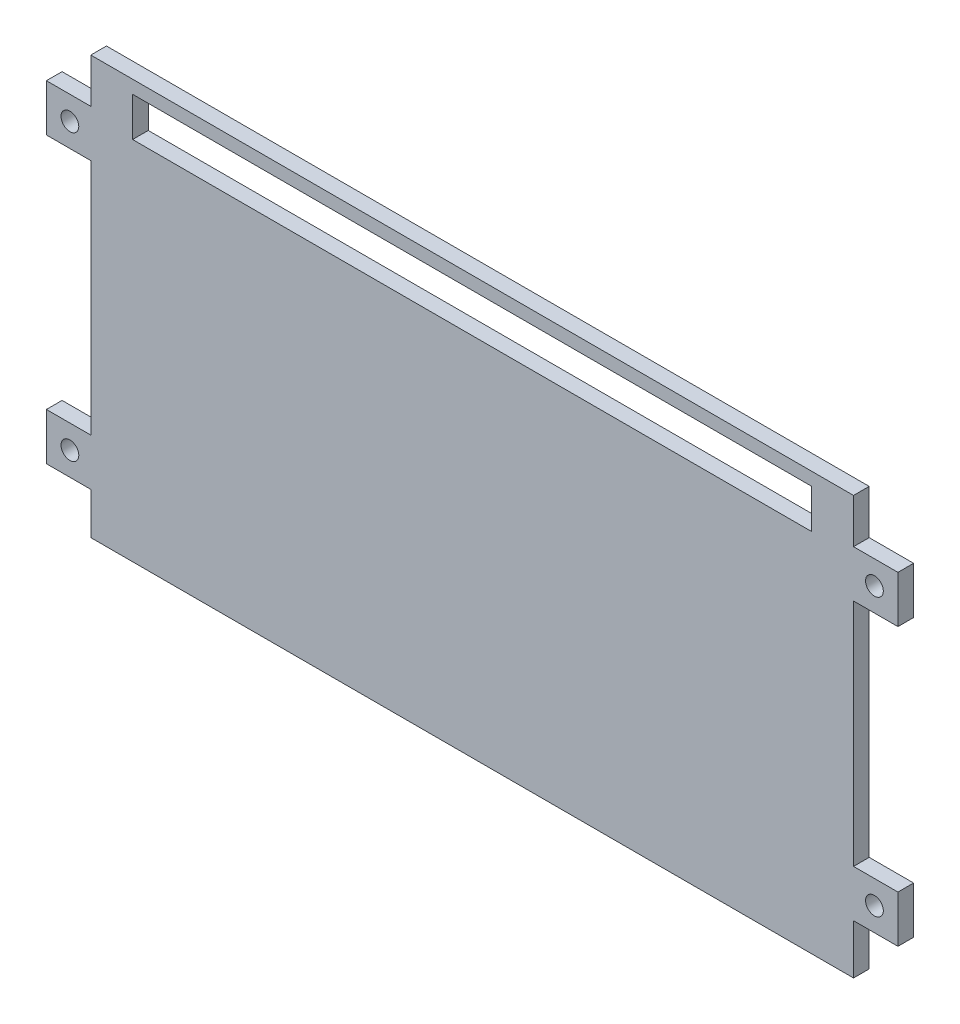
ISO-10303-21;
HEADER;
FILE_DESCRIPTION(('STEP AP214'),'2;1');
FILE_NAME('part.step','',(''),(''),'','','');
FILE_SCHEMA(('AUTOMOTIVE_DESIGN { 1 0 10303 214 1 1 1 1 }'));
ENDSEC;
DATA;
#1=APPLICATION_CONTEXT('core data for automotive mechanical design processes');
#2=APPLICATION_PROTOCOL_DEFINITION('international standard','automotive_design',2000,#1);
#3=PRODUCT_CONTEXT('',#1,'mechanical');
#4=PRODUCT('Part','Part','',(#3));
#5=PRODUCT_RELATED_PRODUCT_CATEGORY('part','',(#4));
#6=PRODUCT_DEFINITION_FORMATION('','',#4);
#7=PRODUCT_DEFINITION_CONTEXT('part definition',#1,'design');
#8=PRODUCT_DEFINITION('design','',#6,#7);
#9=PRODUCT_DEFINITION_SHAPE('','',#8);
#10=(LENGTH_UNIT() NAMED_UNIT(*) SI_UNIT(.MILLI.,.METRE.));
#11=(NAMED_UNIT(*) PLANE_ANGLE_UNIT() SI_UNIT($,.RADIAN.));
#12=(NAMED_UNIT(*) SI_UNIT($,.STERADIAN.) SOLID_ANGLE_UNIT());
#13=UNCERTAINTY_MEASURE_WITH_UNIT(LENGTH_MEASURE(1.E-05),#10,'distance_accuracy_value','');
#14=(GEOMETRIC_REPRESENTATION_CONTEXT(3) GLOBAL_UNCERTAINTY_ASSIGNED_CONTEXT((#13)) GLOBAL_UNIT_ASSIGNED_CONTEXT((#10,
#11,#12)) REPRESENTATION_CONTEXT('',''));
#15=CARTESIAN_POINT('',(0.,0.,0.));
#16=DIRECTION('',(0.,0.,1.));
#17=DIRECTION('',(1.,0.,0.));
#18=AXIS2_PLACEMENT_3D('',#15,#16,#17);
#19=CARTESIAN_POINT('',(112.,-117.,217.3));
#20=DIRECTION('',(0.,0.,1.));
#21=DIRECTION('',(1.,0.,0.));
#22=AXIS2_PLACEMENT_3D('',#19,#20,#21);
#23=CYLINDRICAL_SURFACE('',#22,1.7);
#24=DIRECTION('',(0.,0.,1.));
#25=VECTOR('',#24,1.);
#26=CARTESIAN_POINT('',(113.7,-117.,217.3));
#27=LINE('',#26,#25);
#28=CARTESIAN_POINT('',(113.7,-117.,217.5));
#29=VERTEX_POINT('',#28);
#30=CARTESIAN_POINT('',(113.7,-117.,220.5));
#31=VERTEX_POINT('',#30);
#32=EDGE_CURVE('E10',#29,#31,#27,.T.);
#33=ORIENTED_EDGE('',*,*,#32,.F.);
#34=CARTESIAN_POINT('',(112.,-117.,217.5));
#35=DIRECTION('',(0.,0.,1.));
#36=DIRECTION('',(1.,0.,0.));
#37=AXIS2_PLACEMENT_3D('',#34,#35,#36);
#38=CIRCLE('',#37,1.7);
#39=EDGE_CURVE('E312',#29,#29,#38,.T.);
#40=ORIENTED_EDGE('',*,*,#39,.F.);
#41=ORIENTED_EDGE('',*,*,#32,.T.);
#42=CARTESIAN_POINT('',(112.,-117.,220.5));
#43=DIRECTION('',(0.,0.,1.));
#44=DIRECTION('',(1.,0.,0.));
#45=AXIS2_PLACEMENT_3D('',#42,#43,#44);
#46=CIRCLE('',#45,1.7);
#47=EDGE_CURVE('E445',#31,#31,#46,.T.);
#48=ORIENTED_EDGE('',*,*,#47,.T.);
#49=EDGE_LOOP('',(#33,#40,#41,#48));
#50=FACE_BOUND('',#49,.T.);
#51=ADVANCED_FACE('F15',(#50),#23,.F.);
#52=CARTESIAN_POINT('',(-30.,-106.5,217.4));
#53=DIRECTION('',(0.,1.,0.));
#54=DIRECTION('',(1.,0.,0.));
#55=AXIS2_PLACEMENT_3D('',#52,#53,#54);
#56=PLANE('',#55);
#57=DIRECTION('',(-1.,0.,0.));
#58=VECTOR('',#57,1.);
#59=CARTESIAN_POINT('',(-34.,-106.5,220.5));
#60=LINE('',#59,#58);
#61=CARTESIAN_POINT('',(100.,-106.5,220.5));
#62=VERTEX_POINT('',#61);
#63=CARTESIAN_POINT('',(-30.,-106.5,220.5));
#64=VERTEX_POINT('',#63);
#65=EDGE_CURVE('E277',#62,#64,#60,.T.);
#66=ORIENTED_EDGE('',*,*,#65,.T.);
#67=DIRECTION('',(0.,0.,1.));
#68=VECTOR('',#67,1.);
#69=CARTESIAN_POINT('',(-30.,-106.5,217.4));
#70=LINE('',#69,#68);
#71=CARTESIAN_POINT('',(-30.,-106.5,217.5));
#72=VERTEX_POINT('',#71);
#73=EDGE_CURVE('E26',#72,#64,#70,.T.);
#74=ORIENTED_EDGE('',*,*,#73,.F.);
#75=DIRECTION('',(-1.,0.,0.));
#76=VECTOR('',#75,1.);
#77=CARTESIAN_POINT('',(-34.,-106.5,217.5));
#78=LINE('',#77,#76);
#79=CARTESIAN_POINT('',(100.,-106.5,217.5));
#80=VERTEX_POINT('',#79);
#81=EDGE_CURVE('E382',#80,#72,#78,.T.);
#82=ORIENTED_EDGE('',*,*,#81,.F.);
#83=DIRECTION('',(0.,0.,1.));
#84=VECTOR('',#83,1.);
#85=CARTESIAN_POINT('',(100.,-106.5,217.4));
#86=LINE('',#85,#84);
#87=EDGE_CURVE('E308',#80,#62,#86,.T.);
#88=ORIENTED_EDGE('',*,*,#87,.T.);
#89=EDGE_LOOP('',(#66,#74,#82,#88));
#90=FACE_BOUND('',#89,.T.);
#91=ADVANCED_FACE('F612',(#90),#56,.F.);
#92=CARTESIAN_POINT('',(-30.,-114.,217.4));
#93=DIRECTION('',(1.,0.,0.));
#94=DIRECTION('',(0.,1.,0.));
#95=AXIS2_PLACEMENT_3D('',#92,#93,#94);
#96=PLANE('',#95);
#97=DIRECTION('',(0.,0.,1.));
#98=VECTOR('',#97,1.);
#99=CARTESIAN_POINT('',(-30.,-114.,217.4));
#100=LINE('',#99,#98);
#101=CARTESIAN_POINT('',(-30.,-114.,217.5));
#102=VERTEX_POINT('',#101);
#103=CARTESIAN_POINT('',(-30.,-114.,220.5));
#104=VERTEX_POINT('',#103);
#105=EDGE_CURVE('E311',#102,#104,#100,.T.);
#106=ORIENTED_EDGE('',*,*,#105,.F.);
#107=DIRECTION('',(0.,1.,0.));
#108=VECTOR('',#107,1.);
#109=CARTESIAN_POINT('',(-30.,-149.,217.5));
#110=LINE('',#109,#108);
#111=EDGE_CURVE('E329',#102,#72,#110,.T.);
#112=ORIENTED_EDGE('',*,*,#111,.T.);
#113=ORIENTED_EDGE('',*,*,#73,.T.);
#114=DIRECTION('',(0.,1.,0.));
#115=VECTOR('',#114,1.);
#116=CARTESIAN_POINT('',(-30.,-149.,220.5));
#117=LINE('',#116,#115);
#118=EDGE_CURVE('E282',#104,#64,#117,.T.);
#119=ORIENTED_EDGE('',*,*,#118,.F.);
#120=EDGE_LOOP('',(#106,#112,#113,#119));
#121=FACE_BOUND('',#120,.T.);
#122=ADVANCED_FACE('F17',(#121),#96,.T.);
#123=CARTESIAN_POINT('',(100.,-114.,217.4));
#124=DIRECTION('',(1.,0.,0.));
#125=DIRECTION('',(0.,1.,0.));
#126=AXIS2_PLACEMENT_3D('',#123,#124,#125);
#127=PLANE('',#126);
#128=DIRECTION('',(0.,1.,0.));
#129=VECTOR('',#128,1.);
#130=CARTESIAN_POINT('',(100.,-149.,220.5));
#131=LINE('',#130,#129);
#132=CARTESIAN_POINT('',(100.,-114.,220.5));
#133=VERTEX_POINT('',#132);
#134=EDGE_CURVE('E281',#133,#62,#131,.T.);
#135=ORIENTED_EDGE('',*,*,#134,.T.);
#136=ORIENTED_EDGE('',*,*,#87,.F.);
#137=DIRECTION('',(0.,1.,0.));
#138=VECTOR('',#137,1.);
#139=CARTESIAN_POINT('',(100.,-149.,217.5));
#140=LINE('',#139,#138);
#141=CARTESIAN_POINT('',(100.,-114.,217.5));
#142=VERTEX_POINT('',#141);
#143=EDGE_CURVE('E378',#142,#80,#140,.T.);
#144=ORIENTED_EDGE('',*,*,#143,.F.);
#145=DIRECTION('',(0.,0.,1.));
#146=VECTOR('',#145,1.);
#147=CARTESIAN_POINT('',(100.,-114.,217.4));
#148=LINE('',#147,#146);
#149=EDGE_CURVE('E350',#142,#133,#148,.T.);
#150=ORIENTED_EDGE('',*,*,#149,.T.);
#151=EDGE_LOOP('',(#135,#136,#144,#150));
#152=FACE_BOUND('',#151,.T.);
#153=ADVANCED_FACE('F627',(#152),#127,.F.);
#154=CARTESIAN_POINT('',(-30.,-114.,217.4));
#155=DIRECTION('',(0.,1.,0.));
#156=DIRECTION('',(1.,0.,0.));
#157=AXIS2_PLACEMENT_3D('',#154,#155,#156);
#158=PLANE('',#157);
#159=ORIENTED_EDGE('',*,*,#149,.F.);
#160=DIRECTION('',(-1.,0.,0.));
#161=VECTOR('',#160,1.);
#162=CARTESIAN_POINT('',(-34.,-114.,217.5));
#163=LINE('',#162,#161);
#164=EDGE_CURVE('E315',#142,#102,#163,.T.);
#165=ORIENTED_EDGE('',*,*,#164,.T.);
#166=ORIENTED_EDGE('',*,*,#105,.T.);
#167=DIRECTION('',(-1.,0.,0.));
#168=VECTOR('',#167,1.);
#169=CARTESIAN_POINT('',(-34.,-114.,220.5));
#170=LINE('',#169,#168);
#171=EDGE_CURVE('E292',#133,#104,#170,.T.);
#172=ORIENTED_EDGE('',*,*,#171,.F.);
#173=EDGE_LOOP('',(#159,#165,#166,#172));
#174=FACE_BOUND('',#173,.T.);
#175=ADVANCED_FACE('F624',(#174),#158,.T.);
#176=CARTESIAN_POINT('',(-42.,-117.,217.3));
#177=DIRECTION('',(0.,0.,1.));
#178=DIRECTION('',(1.,0.,0.));
#179=AXIS2_PLACEMENT_3D('',#176,#177,#178);
#180=CYLINDRICAL_SURFACE('',#179,1.7);
#181=DIRECTION('',(0.,0.,1.));
#182=VECTOR('',#181,1.);
#183=CARTESIAN_POINT('',(-40.3,-117.,217.3));
#184=LINE('',#183,#182);
#185=CARTESIAN_POINT('',(-40.3,-117.,217.5));
#186=VERTEX_POINT('',#185);
#187=CARTESIAN_POINT('',(-40.3,-117.,220.5));
#188=VERTEX_POINT('',#187);
#189=EDGE_CURVE('E354',#186,#188,#184,.T.);
#190=ORIENTED_EDGE('',*,*,#189,.F.);
#191=CARTESIAN_POINT('',(-42.,-117.,217.5));
#192=DIRECTION('',(0.,0.,1.));
#193=DIRECTION('',(1.,0.,0.));
#194=AXIS2_PLACEMENT_3D('',#191,#192,#193);
#195=CIRCLE('',#194,1.7);
#196=EDGE_CURVE('E363',#186,#186,#195,.T.);
#197=ORIENTED_EDGE('',*,*,#196,.F.);
#198=ORIENTED_EDGE('',*,*,#189,.T.);
#199=CARTESIAN_POINT('',(-42.,-117.,220.5));
#200=DIRECTION('',(0.,0.,1.));
#201=DIRECTION('',(1.,0.,0.));
#202=AXIS2_PLACEMENT_3D('',#199,#200,#201);
#203=CIRCLE('',#202,1.7);
#204=EDGE_CURVE('E296',#188,#188,#203,.T.);
#205=ORIENTED_EDGE('',*,*,#204,.T.);
#206=EDGE_LOOP('',(#190,#197,#198,#205));
#207=FACE_BOUND('',#206,.T.);
#208=ADVANCED_FACE('F622',(#207),#180,.F.);
#209=CARTESIAN_POINT('',(112.,-170.,217.3));
#210=DIRECTION('',(0.,0.,1.));
#211=DIRECTION('',(1.,0.,0.));
#212=AXIS2_PLACEMENT_3D('',#209,#210,#211);
#213=CYLINDRICAL_SURFACE('',#212,1.7);
#214=DIRECTION('',(0.,0.,1.));
#215=VECTOR('',#214,1.);
#216=CARTESIAN_POINT('',(113.7,-170.,217.3));
#217=LINE('',#216,#215);
#218=CARTESIAN_POINT('',(113.7,-170.,217.5));
#219=VERTEX_POINT('',#218);
#220=CARTESIAN_POINT('',(113.7,-170.,220.5));
#221=VERTEX_POINT('',#220);
#222=EDGE_CURVE('E478',#219,#221,#217,.T.);
#223=ORIENTED_EDGE('',*,*,#222,.F.);
#224=CARTESIAN_POINT('',(112.,-170.,217.5));
#225=DIRECTION('',(0.,0.,1.));
#226=DIRECTION('',(1.,0.,0.));
#227=AXIS2_PLACEMENT_3D('',#224,#225,#226);
#228=CIRCLE('',#227,1.7);
#229=EDGE_CURVE('E359',#219,#219,#228,.T.);
#230=ORIENTED_EDGE('',*,*,#229,.F.);
#231=ORIENTED_EDGE('',*,*,#222,.T.);
#232=CARTESIAN_POINT('',(112.,-170.,220.5));
#233=DIRECTION('',(0.,0.,1.));
#234=DIRECTION('',(1.,0.,0.));
#235=AXIS2_PLACEMENT_3D('',#232,#233,#234);
#236=CIRCLE('',#235,1.7);
#237=EDGE_CURVE('E428',#221,#221,#236,.T.);
#238=ORIENTED_EDGE('',*,*,#237,.T.);
#239=EDGE_LOOP('',(#223,#230,#231,#238));
#240=FACE_BOUND('',#239,.T.);
#241=ADVANCED_FACE('F619',(#240),#213,.F.);
#242=CARTESIAN_POINT('',(-42.,-171.5,217.3));
#243=DIRECTION('',(0.,0.,1.));
#244=DIRECTION('',(1.,0.,0.));
#245=AXIS2_PLACEMENT_3D('',#242,#243,#244);
#246=CYLINDRICAL_SURFACE('',#245,1.7);
#247=DIRECTION('',(0.,0.,1.));
#248=VECTOR('',#247,1.);
#249=CARTESIAN_POINT('',(-40.3,-171.5,217.3));
#250=LINE('',#249,#248);
#251=CARTESIAN_POINT('',(-40.3,-171.5,217.5));
#252=VERTEX_POINT('',#251);
#253=CARTESIAN_POINT('',(-40.3,-171.5,220.5));
#254=VERTEX_POINT('',#253);
#255=EDGE_CURVE('E286',#252,#254,#250,.T.);
#256=ORIENTED_EDGE('',*,*,#255,.F.);
#257=CARTESIAN_POINT('',(-42.,-171.5,217.5));
#258=DIRECTION('',(0.,0.,1.));
#259=DIRECTION('',(1.,0.,0.));
#260=AXIS2_PLACEMENT_3D('',#257,#258,#259);
#261=CIRCLE('',#260,1.7);
#262=EDGE_CURVE('E364',#252,#252,#261,.T.);
#263=ORIENTED_EDGE('',*,*,#262,.F.);
#264=ORIENTED_EDGE('',*,*,#255,.T.);
#265=CARTESIAN_POINT('',(-42.,-171.5,220.5));
#266=DIRECTION('',(0.,0.,1.));
#267=DIRECTION('',(1.,0.,0.));
#268=AXIS2_PLACEMENT_3D('',#265,#266,#267);
#269=CIRCLE('',#268,1.7);
#270=EDGE_CURVE('E421',#254,#254,#269,.T.);
#271=ORIENTED_EDGE('',*,*,#270,.T.);
#272=EDGE_LOOP('',(#256,#263,#264,#271));
#273=FACE_BOUND('',#272,.T.);
#274=ADVANCED_FACE('F593',(#273),#246,.F.);
#275=CARTESIAN_POINT('',(108.,-184.,217.5));
#276=DIRECTION('',(1.,0.,0.));
#277=DIRECTION('',(0.,1.,0.));
#278=AXIS2_PLACEMENT_3D('',#275,#276,#277);
#279=PLANE('',#278);
#280=DIRECTION('',(0.,1.,0.));
#281=VECTOR('',#280,1.);
#282=CARTESIAN_POINT('',(108.,-184.,220.5));
#283=LINE('',#282,#281);
#284=CARTESIAN_POINT('',(108.,-112.5,220.5));
#285=VERTEX_POINT('',#284);
#286=CARTESIAN_POINT('',(108.,-104.,220.5));
#287=VERTEX_POINT('',#286);
#288=EDGE_CURVE('E288',#285,#287,#283,.T.);
#289=ORIENTED_EDGE('',*,*,#288,.F.);
#290=DIRECTION('',(0.,0.,1.));
#291=VECTOR('',#290,1.);
#292=CARTESIAN_POINT('',(108.,-112.5,217.5));
#293=LINE('',#292,#291);
#294=CARTESIAN_POINT('',(108.,-112.5,217.5));
#295=VERTEX_POINT('',#294);
#296=EDGE_CURVE('E287',#295,#285,#293,.T.);
#297=ORIENTED_EDGE('',*,*,#296,.F.);
#298=DIRECTION('',(0.,1.,0.));
#299=VECTOR('',#298,1.);
#300=CARTESIAN_POINT('',(108.,-184.,217.5));
#301=LINE('',#300,#299);
#302=CARTESIAN_POINT('',(108.,-104.,217.5));
#303=VERTEX_POINT('',#302);
#304=EDGE_CURVE('E251',#295,#303,#301,.T.);
#305=ORIENTED_EDGE('',*,*,#304,.T.);
#306=DIRECTION('',(0.,0.,1.));
#307=VECTOR('',#306,1.);
#308=CARTESIAN_POINT('',(108.,-104.,217.5));
#309=LINE('',#308,#307);
#310=EDGE_CURVE('E283',#303,#287,#309,.T.);
#311=ORIENTED_EDGE('',*,*,#310,.T.);
#312=EDGE_LOOP('',(#289,#297,#305,#311));
#313=FACE_BOUND('',#312,.T.);
#314=ADVANCED_FACE('F412',(#313),#279,.T.);
#315=CARTESIAN_POINT('',(-38.,-104.,217.5));
#316=DIRECTION('',(0.,1.,0.));
#317=DIRECTION('',(1.,0.,0.));
#318=AXIS2_PLACEMENT_3D('',#315,#316,#317);
#319=PLANE('',#318);
#320=DIRECTION('',(1.,0.,0.));
#321=VECTOR('',#320,1.);
#322=CARTESIAN_POINT('',(-38.,-104.,217.5));
#323=LINE('',#322,#321);
#324=CARTESIAN_POINT('',(-38.,-104.,217.5));
#325=VERTEX_POINT('',#324);
#326=EDGE_CURVE('E257',#325,#303,#323,.T.);
#327=ORIENTED_EDGE('',*,*,#326,.F.);
#328=DIRECTION('',(0.,0.,1.));
#329=VECTOR('',#328,1.);
#330=CARTESIAN_POINT('',(-38.,-104.,217.5));
#331=LINE('',#330,#329);
#332=CARTESIAN_POINT('',(-38.,-104.,220.5));
#333=VERTEX_POINT('',#332);
#334=EDGE_CURVE('E234',#325,#333,#331,.T.);
#335=ORIENTED_EDGE('',*,*,#334,.T.);
#336=DIRECTION('',(1.,0.,0.));
#337=VECTOR('',#336,1.);
#338=CARTESIAN_POINT('',(-38.,-104.,220.5));
#339=LINE('',#338,#337);
#340=EDGE_CURVE('E268',#333,#287,#339,.T.);
#341=ORIENTED_EDGE('',*,*,#340,.T.);
#342=ORIENTED_EDGE('',*,*,#310,.F.);
#343=EDGE_LOOP('',(#327,#335,#341,#342));
#344=FACE_BOUND('',#343,.T.);
#345=ADVANCED_FACE('F407',(#344),#319,.T.);
#346=CARTESIAN_POINT('',(107.,-112.5,217.5));
#347=DIRECTION('',(0.,1.,0.));
#348=DIRECTION('',(1.,0.,0.));
#349=AXIS2_PLACEMENT_3D('',#346,#347,#348);
#350=PLANE('',#349);
#351=DIRECTION('',(1.,0.,0.));
#352=VECTOR('',#351,1.);
#353=CARTESIAN_POINT('',(107.,-112.5,217.5));
#354=LINE('',#353,#352);
#355=CARTESIAN_POINT('',(116.5,-112.5,217.5));
#356=VERTEX_POINT('',#355);
#357=EDGE_CURVE('E19',#295,#356,#354,.T.);
#358=ORIENTED_EDGE('',*,*,#357,.F.);
#359=ORIENTED_EDGE('',*,*,#296,.T.);
#360=DIRECTION('',(1.,0.,0.));
#361=VECTOR('',#360,1.);
#362=CARTESIAN_POINT('',(107.,-112.5,220.5));
#363=LINE('',#362,#361);
#364=CARTESIAN_POINT('',(116.5,-112.5,220.5));
#365=VERTEX_POINT('',#364);
#366=EDGE_CURVE('E229',#285,#365,#363,.T.);
#367=ORIENTED_EDGE('',*,*,#366,.T.);
#368=DIRECTION('',(0.,0.,1.));
#369=VECTOR('',#368,1.);
#370=CARTESIAN_POINT('',(116.5,-112.5,217.5));
#371=LINE('',#370,#369);
#372=EDGE_CURVE('E223',#356,#365,#371,.T.);
#373=ORIENTED_EDGE('',*,*,#372,.F.);
#374=EDGE_LOOP('',(#358,#359,#367,#373));
#375=FACE_BOUND('',#374,.T.);
#376=ADVANCED_FACE('F225',(#375),#350,.T.);
#377=CARTESIAN_POINT('',(-38.,-184.,217.5));
#378=DIRECTION('',(1.,0.,0.));
#379=DIRECTION('',(0.,1.,0.));
#380=AXIS2_PLACEMENT_3D('',#377,#378,#379);
#381=PLANE('',#380);
#382=ORIENTED_EDGE('',*,*,#334,.F.);
#383=DIRECTION('',(0.,1.,0.));
#384=VECTOR('',#383,1.);
#385=CARTESIAN_POINT('',(-38.,-184.,217.5));
#386=LINE('',#385,#384);
#387=CARTESIAN_POINT('',(-38.,-112.5,217.5));
#388=VERTEX_POINT('',#387);
#389=EDGE_CURVE('E264',#388,#325,#386,.T.);
#390=ORIENTED_EDGE('',*,*,#389,.F.);
#391=DIRECTION('',(0.,0.,1.));
#392=VECTOR('',#391,1.);
#393=CARTESIAN_POINT('',(-38.,-112.5,217.5));
#394=LINE('',#393,#392);
#395=CARTESIAN_POINT('',(-38.,-112.5,220.5));
#396=VERTEX_POINT('',#395);
#397=EDGE_CURVE('E109',#388,#396,#394,.T.);
#398=ORIENTED_EDGE('',*,*,#397,.T.);
#399=DIRECTION('',(0.,1.,0.));
#400=VECTOR('',#399,1.);
#401=CARTESIAN_POINT('',(-38.,-184.,220.5));
#402=LINE('',#401,#400);
#403=EDGE_CURVE('E273',#396,#333,#402,.T.);
#404=ORIENTED_EDGE('',*,*,#403,.T.);
#405=EDGE_LOOP('',(#382,#390,#398,#404));
#406=FACE_BOUND('',#405,.T.);
#407=ADVANCED_FACE('F649',(#406),#381,.F.);
#408=CARTESIAN_POINT('',(116.5,-121.5,217.5));
#409=DIRECTION('',(1.,0.,0.));
#410=DIRECTION('',(0.,1.,0.));
#411=AXIS2_PLACEMENT_3D('',#408,#409,#410);
#412=PLANE('',#411);
#413=DIRECTION('',(0.,0.,1.));
#414=VECTOR('',#413,1.);
#415=CARTESIAN_POINT('',(116.5,-121.5,217.5));
#416=LINE('',#415,#414);
#417=CARTESIAN_POINT('',(116.5,-121.5,217.5));
#418=VERTEX_POINT('',#417);
#419=CARTESIAN_POINT('',(116.5,-121.5,220.5));
#420=VERTEX_POINT('',#419);
#421=EDGE_CURVE('E240',#418,#420,#416,.T.);
#422=ORIENTED_EDGE('',*,*,#421,.F.);
#423=DIRECTION('',(0.,1.,0.));
#424=VECTOR('',#423,1.);
#425=CARTESIAN_POINT('',(116.5,-121.5,217.5));
#426=LINE('',#425,#424);
#427=EDGE_CURVE('E237',#418,#356,#426,.T.);
#428=ORIENTED_EDGE('',*,*,#427,.T.);
#429=ORIENTED_EDGE('',*,*,#372,.T.);
#430=DIRECTION('',(0.,1.,0.));
#431=VECTOR('',#430,1.);
#432=CARTESIAN_POINT('',(116.5,-121.5,220.5));
#433=LINE('',#432,#431);
#434=EDGE_CURVE('E322',#420,#365,#433,.T.);
#435=ORIENTED_EDGE('',*,*,#434,.F.);
#436=EDGE_LOOP('',(#422,#428,#429,#435));
#437=FACE_BOUND('',#436,.T.);
#438=ADVANCED_FACE('F238',(#437),#412,.T.);
#439=CARTESIAN_POINT('',(-46.5,-112.5,217.5));
#440=DIRECTION('',(0.,1.,0.));
#441=DIRECTION('',(1.,0.,0.));
#442=AXIS2_PLACEMENT_3D('',#439,#440,#441);
#443=PLANE('',#442);
#444=DIRECTION('',(1.,0.,0.));
#445=VECTOR('',#444,1.);
#446=CARTESIAN_POINT('',(-46.5,-112.5,217.5));
#447=LINE('',#446,#445);
#448=CARTESIAN_POINT('',(-46.5,-112.5,217.5));
#449=VERTEX_POINT('',#448);
#450=EDGE_CURVE('E449',#449,#388,#447,.T.);
#451=ORIENTED_EDGE('',*,*,#450,.F.);
#452=DIRECTION('',(0.,0.,1.));
#453=VECTOR('',#452,1.);
#454=CARTESIAN_POINT('',(-46.5,-112.5,217.5));
#455=LINE('',#454,#453);
#456=CARTESIAN_POINT('',(-46.5,-112.5,220.5));
#457=VERTEX_POINT('',#456);
#458=EDGE_CURVE('E93',#449,#457,#455,.T.);
#459=ORIENTED_EDGE('',*,*,#458,.T.);
#460=DIRECTION('',(1.,0.,0.));
#461=VECTOR('',#460,1.);
#462=CARTESIAN_POINT('',(-46.5,-112.5,220.5));
#463=LINE('',#462,#461);
#464=EDGE_CURVE('E270',#457,#396,#463,.T.);
#465=ORIENTED_EDGE('',*,*,#464,.T.);
#466=ORIENTED_EDGE('',*,*,#397,.F.);
#467=EDGE_LOOP('',(#451,#459,#465,#466));
#468=FACE_BOUND('',#467,.T.);
#469=ADVANCED_FACE('F737',(#468),#443,.T.);
#470=CARTESIAN_POINT('',(107.,-121.5,217.5));
#471=DIRECTION('',(0.,1.,0.));
#472=DIRECTION('',(1.,0.,0.));
#473=AXIS2_PLACEMENT_3D('',#470,#471,#472);
#474=PLANE('',#473);
#475=ORIENTED_EDGE('',*,*,#421,.T.);
#476=DIRECTION('',(1.,0.,0.));
#477=VECTOR('',#476,1.);
#478=CARTESIAN_POINT('',(107.,-121.5,220.5));
#479=LINE('',#478,#477);
#480=CARTESIAN_POINT('',(108.,-121.5,220.5));
#481=VERTEX_POINT('',#480);
#482=EDGE_CURVE('E325',#481,#420,#479,.T.);
#483=ORIENTED_EDGE('',*,*,#482,.F.);
#484=DIRECTION('',(0.,0.,1.));
#485=VECTOR('',#484,1.);
#486=CARTESIAN_POINT('',(108.,-121.5,217.5));
#487=LINE('',#486,#485);
#488=CARTESIAN_POINT('',(108.,-121.5,217.5));
#489=VERTEX_POINT('',#488);
#490=EDGE_CURVE('E339',#489,#481,#487,.T.);
#491=ORIENTED_EDGE('',*,*,#490,.F.);
#492=DIRECTION('',(1.,0.,0.));
#493=VECTOR('',#492,1.);
#494=CARTESIAN_POINT('',(107.,-121.5,217.5));
#495=LINE('',#494,#493);
#496=EDGE_CURVE('E245',#489,#418,#495,.T.);
#497=ORIENTED_EDGE('',*,*,#496,.T.);
#498=EDGE_LOOP('',(#475,#483,#491,#497));
#499=FACE_BOUND('',#498,.T.);
#500=ADVANCED_FACE('F710',(#499),#474,.F.);
#501=CARTESIAN_POINT('',(-46.5,-121.5,217.5));
#502=DIRECTION('',(1.,0.,0.));
#503=DIRECTION('',(0.,1.,0.));
#504=AXIS2_PLACEMENT_3D('',#501,#502,#503);
#505=PLANE('',#504);
#506=DIRECTION('',(0.,1.,0.));
#507=VECTOR('',#506,1.);
#508=CARTESIAN_POINT('',(-46.5,-121.5,220.5));
#509=LINE('',#508,#507);
#510=CARTESIAN_POINT('',(-46.5,-121.5,220.5));
#511=VERTEX_POINT('',#510);
#512=EDGE_CURVE('E272',#511,#457,#509,.T.);
#513=ORIENTED_EDGE('',*,*,#512,.T.);
#514=ORIENTED_EDGE('',*,*,#458,.F.);
#515=DIRECTION('',(0.,1.,0.));
#516=VECTOR('',#515,1.);
#517=CARTESIAN_POINT('',(-46.5,-121.5,217.5));
#518=LINE('',#517,#516);
#519=CARTESIAN_POINT('',(-46.5,-121.5,217.5));
#520=VERTEX_POINT('',#519);
#521=EDGE_CURVE('E536',#520,#449,#518,.T.);
#522=ORIENTED_EDGE('',*,*,#521,.F.);
#523=DIRECTION('',(0.,0.,1.));
#524=VECTOR('',#523,1.);
#525=CARTESIAN_POINT('',(-46.5,-121.5,217.5));
#526=LINE('',#525,#524);
#527=EDGE_CURVE('E456',#520,#511,#526,.T.);
#528=ORIENTED_EDGE('',*,*,#527,.T.);
#529=EDGE_LOOP('',(#513,#514,#522,#528));
#530=FACE_BOUND('',#529,.T.);
#531=ADVANCED_FACE('F641',(#530),#505,.F.);
#532=CARTESIAN_POINT('',(108.,-184.,217.5));
#533=DIRECTION('',(1.,0.,0.));
#534=DIRECTION('',(0.,1.,0.));
#535=AXIS2_PLACEMENT_3D('',#532,#533,#534);
#536=PLANE('',#535);
#537=DIRECTION('',(0.,1.,0.));
#538=VECTOR('',#537,1.);
#539=CARTESIAN_POINT('',(108.,-184.,220.5));
#540=LINE('',#539,#538);
#541=CARTESIAN_POINT('',(108.,-165.5,220.5));
#542=VERTEX_POINT('',#541);
#543=EDGE_CURVE('E345',#542,#481,#540,.T.);
#544=ORIENTED_EDGE('',*,*,#543,.F.);
#545=DIRECTION('',(0.,0.,1.));
#546=VECTOR('',#545,1.);
#547=CARTESIAN_POINT('',(108.,-165.5,217.5));
#548=LINE('',#547,#546);
#549=CARTESIAN_POINT('',(108.,-165.5,217.5));
#550=VERTEX_POINT('',#549);
#551=EDGE_CURVE('E475',#550,#542,#548,.T.);
#552=ORIENTED_EDGE('',*,*,#551,.F.);
#553=DIRECTION('',(0.,1.,0.));
#554=VECTOR('',#553,1.);
#555=CARTESIAN_POINT('',(108.,-184.,217.5));
#556=LINE('',#555,#554);
#557=EDGE_CURVE('E462',#550,#489,#556,.T.);
#558=ORIENTED_EDGE('',*,*,#557,.T.);
#559=ORIENTED_EDGE('',*,*,#490,.T.);
#560=EDGE_LOOP('',(#544,#552,#558,#559));
#561=FACE_BOUND('',#560,.T.);
#562=ADVANCED_FACE('F637',(#561),#536,.T.);
#563=CARTESIAN_POINT('',(-46.5,-121.5,217.5));
#564=DIRECTION('',(0.,1.,0.));
#565=DIRECTION('',(1.,0.,0.));
#566=AXIS2_PLACEMENT_3D('',#563,#564,#565);
#567=PLANE('',#566);
#568=DIRECTION('',(0.,0.,1.));
#569=VECTOR('',#568,1.);
#570=CARTESIAN_POINT('',(-38.,-121.5,217.5));
#571=LINE('',#570,#569);
#572=CARTESIAN_POINT('',(-38.,-121.5,217.5));
#573=VERTEX_POINT('',#572);
#574=CARTESIAN_POINT('',(-38.,-121.5,220.5));
#575=VERTEX_POINT('',#574);
#576=EDGE_CURVE('E473',#573,#575,#571,.T.);
#577=ORIENTED_EDGE('',*,*,#576,.T.);
#578=DIRECTION('',(1.,0.,0.));
#579=VECTOR('',#578,1.);
#580=CARTESIAN_POINT('',(-46.5,-121.5,220.5));
#581=LINE('',#580,#579);
#582=EDGE_CURVE('E276',#511,#575,#581,.T.);
#583=ORIENTED_EDGE('',*,*,#582,.F.);
#584=ORIENTED_EDGE('',*,*,#527,.F.);
#585=DIRECTION('',(1.,0.,0.));
#586=VECTOR('',#585,1.);
#587=CARTESIAN_POINT('',(-46.5,-121.5,217.5));
#588=LINE('',#587,#586);
#589=EDGE_CURVE('E371',#520,#573,#588,.T.);
#590=ORIENTED_EDGE('',*,*,#589,.T.);
#591=EDGE_LOOP('',(#577,#583,#584,#590));
#592=FACE_BOUND('',#591,.T.);
#593=ADVANCED_FACE('F640',(#592),#567,.F.);
#594=CARTESIAN_POINT('',(107.,-165.5,217.5));
#595=DIRECTION('',(0.,1.,0.));
#596=DIRECTION('',(1.,0.,0.));
#597=AXIS2_PLACEMENT_3D('',#594,#595,#596);
#598=PLANE('',#597);
#599=DIRECTION('',(1.,0.,0.));
#600=VECTOR('',#599,1.);
#601=CARTESIAN_POINT('',(107.,-165.5,217.5));
#602=LINE('',#601,#600);
#603=CARTESIAN_POINT('',(116.5,-165.5,217.5));
#604=VERTEX_POINT('',#603);
#605=EDGE_CURVE('E377',#550,#604,#602,.T.);
#606=ORIENTED_EDGE('',*,*,#605,.F.);
#607=ORIENTED_EDGE('',*,*,#551,.T.);
#608=DIRECTION('',(1.,0.,0.));
#609=VECTOR('',#608,1.);
#610=CARTESIAN_POINT('',(107.,-165.5,220.5));
#611=LINE('',#610,#609);
#612=CARTESIAN_POINT('',(116.5,-165.5,220.5));
#613=VERTEX_POINT('',#612);
#614=EDGE_CURVE('E349',#542,#613,#611,.T.);
#615=ORIENTED_EDGE('',*,*,#614,.T.);
#616=DIRECTION('',(0.,0.,1.));
#617=VECTOR('',#616,1.);
#618=CARTESIAN_POINT('',(116.5,-165.5,217.5));
#619=LINE('',#618,#617);
#620=EDGE_CURVE('E476',#604,#613,#619,.T.);
#621=ORIENTED_EDGE('',*,*,#620,.F.);
#622=EDGE_LOOP('',(#606,#607,#615,#621));
#623=FACE_BOUND('',#622,.T.);
#624=ADVANCED_FACE('F668',(#623),#598,.T.);
#625=CARTESIAN_POINT('',(-38.,-184.,217.5));
#626=DIRECTION('',(1.,0.,0.));
#627=DIRECTION('',(0.,1.,0.));
#628=AXIS2_PLACEMENT_3D('',#625,#626,#627);
#629=PLANE('',#628);
#630=ORIENTED_EDGE('',*,*,#576,.F.);
#631=DIRECTION('',(0.,1.,0.));
#632=VECTOR('',#631,1.);
#633=CARTESIAN_POINT('',(-38.,-184.,217.5));
#634=LINE('',#633,#632);
#635=CARTESIAN_POINT('',(-38.,-167.,217.5));
#636=VERTEX_POINT('',#635);
#637=EDGE_CURVE('E367',#636,#573,#634,.T.);
#638=ORIENTED_EDGE('',*,*,#637,.F.);
#639=DIRECTION('',(0.,0.,1.));
#640=VECTOR('',#639,1.);
#641=CARTESIAN_POINT('',(-38.,-167.,217.5));
#642=LINE('',#641,#640);
#643=CARTESIAN_POINT('',(-38.,-167.,220.5));
#644=VERTEX_POINT('',#643);
#645=EDGE_CURVE('E514',#636,#644,#642,.T.);
#646=ORIENTED_EDGE('',*,*,#645,.T.);
#647=DIRECTION('',(0.,1.,0.));
#648=VECTOR('',#647,1.);
#649=CARTESIAN_POINT('',(-38.,-184.,220.5));
#650=LINE('',#649,#648);
#651=EDGE_CURVE('E469',#644,#575,#650,.T.);
#652=ORIENTED_EDGE('',*,*,#651,.T.);
#653=EDGE_LOOP('',(#630,#638,#646,#652));
#654=FACE_BOUND('',#653,.T.);
#655=ADVANCED_FACE('F654',(#654),#629,.F.);
#656=CARTESIAN_POINT('',(116.5,-174.5,217.5));
#657=DIRECTION('',(1.,0.,0.));
#658=DIRECTION('',(0.,1.,0.));
#659=AXIS2_PLACEMENT_3D('',#656,#657,#658);
#660=PLANE('',#659);
#661=DIRECTION('',(0.,0.,1.));
#662=VECTOR('',#661,1.);
#663=CARTESIAN_POINT('',(116.5,-174.5,217.5));
#664=LINE('',#663,#662);
#665=CARTESIAN_POINT('',(116.5,-174.5,217.5));
#666=VERTEX_POINT('',#665);
#667=CARTESIAN_POINT('',(116.5,-174.5,220.5));
#668=VERTEX_POINT('',#667);
#669=EDGE_CURVE('E507',#666,#668,#664,.T.);
#670=ORIENTED_EDGE('',*,*,#669,.F.);
#671=DIRECTION('',(0.,1.,0.));
#672=VECTOR('',#671,1.);
#673=CARTESIAN_POINT('',(116.5,-174.5,217.5));
#674=LINE('',#673,#672);
#675=EDGE_CURVE('E372',#666,#604,#674,.T.);
#676=ORIENTED_EDGE('',*,*,#675,.T.);
#677=ORIENTED_EDGE('',*,*,#620,.T.);
#678=DIRECTION('',(0.,1.,0.));
#679=VECTOR('',#678,1.);
#680=CARTESIAN_POINT('',(116.5,-174.5,220.5));
#681=LINE('',#680,#679);
#682=EDGE_CURVE('E319',#668,#613,#681,.T.);
#683=ORIENTED_EDGE('',*,*,#682,.F.);
#684=EDGE_LOOP('',(#670,#676,#677,#683));
#685=FACE_BOUND('',#684,.T.);
#686=ADVANCED_FACE('F516',(#685),#660,.T.);
#687=CARTESIAN_POINT('',(-46.5,-167.,217.5));
#688=DIRECTION('',(0.,1.,0.));
#689=DIRECTION('',(1.,0.,0.));
#690=AXIS2_PLACEMENT_3D('',#687,#688,#689);
#691=PLANE('',#690);
#692=DIRECTION('',(1.,0.,0.));
#693=VECTOR('',#692,1.);
#694=CARTESIAN_POINT('',(-46.5,-167.,217.5));
#695=LINE('',#694,#693);
#696=CARTESIAN_POINT('',(-46.5,-167.,217.5));
#697=VERTEX_POINT('',#696);
#698=EDGE_CURVE('E301',#697,#636,#695,.T.);
#699=ORIENTED_EDGE('',*,*,#698,.F.);
#700=DIRECTION('',(0.,0.,1.));
#701=VECTOR('',#700,1.);
#702=CARTESIAN_POINT('',(-46.5,-167.,217.5));
#703=LINE('',#702,#701);
#704=CARTESIAN_POINT('',(-46.5,-167.,220.5));
#705=VERTEX_POINT('',#704);
#706=EDGE_CURVE('E306',#697,#705,#703,.T.);
#707=ORIENTED_EDGE('',*,*,#706,.T.);
#708=DIRECTION('',(1.,0.,0.));
#709=VECTOR('',#708,1.);
#710=CARTESIAN_POINT('',(-46.5,-167.,220.5));
#711=LINE('',#710,#709);
#712=EDGE_CURVE('E391',#705,#644,#711,.T.);
#713=ORIENTED_EDGE('',*,*,#712,.T.);
#714=ORIENTED_EDGE('',*,*,#645,.F.);
#715=EDGE_LOOP('',(#699,#707,#713,#714));
#716=FACE_BOUND('',#715,.T.);
#717=ADVANCED_FACE('F643',(#716),#691,.T.);
#718=CARTESIAN_POINT('',(107.,-174.5,217.5));
#719=DIRECTION('',(0.,1.,0.));
#720=DIRECTION('',(1.,0.,0.));
#721=AXIS2_PLACEMENT_3D('',#718,#719,#720);
#722=PLANE('',#721);
#723=ORIENTED_EDGE('',*,*,#669,.T.);
#724=DIRECTION('',(1.,0.,0.));
#725=VECTOR('',#724,1.);
#726=CARTESIAN_POINT('',(107.,-174.5,220.5));
#727=LINE('',#726,#725);
#728=CARTESIAN_POINT('',(108.,-174.5,220.5));
#729=VERTEX_POINT('',#728);
#730=EDGE_CURVE('E316',#729,#668,#727,.T.);
#731=ORIENTED_EDGE('',*,*,#730,.F.);
#732=DIRECTION('',(0.,0.,1.));
#733=VECTOR('',#732,1.);
#734=CARTESIAN_POINT('',(108.,-174.5,217.5));
#735=LINE('',#734,#733);
#736=CARTESIAN_POINT('',(108.,-174.5,217.5));
#737=VERTEX_POINT('',#736);
#738=EDGE_CURVE('E303',#737,#729,#735,.T.);
#739=ORIENTED_EDGE('',*,*,#738,.F.);
#740=DIRECTION('',(1.,0.,0.));
#741=VECTOR('',#740,1.);
#742=CARTESIAN_POINT('',(107.,-174.5,217.5));
#743=LINE('',#742,#741);
#744=EDGE_CURVE('E376',#737,#666,#743,.T.);
#745=ORIENTED_EDGE('',*,*,#744,.T.);
#746=EDGE_LOOP('',(#723,#731,#739,#745));
#747=FACE_BOUND('',#746,.T.);
#748=ADVANCED_FACE('F506',(#747),#722,.F.);
#749=CARTESIAN_POINT('',(-46.5,-176.,217.5));
#750=DIRECTION('',(1.,0.,0.));
#751=DIRECTION('',(0.,1.,0.));
#752=AXIS2_PLACEMENT_3D('',#749,#750,#751);
#753=PLANE('',#752);
#754=DIRECTION('',(0.,1.,0.));
#755=VECTOR('',#754,1.);
#756=CARTESIAN_POINT('',(-46.5,-176.,220.5));
#757=LINE('',#756,#755);
#758=CARTESIAN_POINT('',(-46.5,-176.,220.5));
#759=VERTEX_POINT('',#758);
#760=EDGE_CURVE('E386',#759,#705,#757,.T.);
#761=ORIENTED_EDGE('',*,*,#760,.T.);
#762=ORIENTED_EDGE('',*,*,#706,.F.);
#763=DIRECTION('',(0.,1.,0.));
#764=VECTOR('',#763,1.);
#765=CARTESIAN_POINT('',(-46.5,-176.,217.5));
#766=LINE('',#765,#764);
#767=CARTESIAN_POINT('',(-46.5,-176.,217.5));
#768=VERTEX_POINT('',#767);
#769=EDGE_CURVE('E297',#768,#697,#766,.T.);
#770=ORIENTED_EDGE('',*,*,#769,.F.);
#771=DIRECTION('',(0.,0.,1.));
#772=VECTOR('',#771,1.);
#773=CARTESIAN_POINT('',(-46.5,-176.,217.5));
#774=LINE('',#773,#772);
#775=EDGE_CURVE('E442',#768,#759,#774,.T.);
#776=ORIENTED_EDGE('',*,*,#775,.T.);
#777=EDGE_LOOP('',(#761,#762,#770,#776));
#778=FACE_BOUND('',#777,.T.);
#779=ADVANCED_FACE('F636',(#778),#753,.F.);
#780=CARTESIAN_POINT('',(108.,-184.,217.5));
#781=DIRECTION('',(1.,0.,0.));
#782=DIRECTION('',(0.,1.,0.));
#783=AXIS2_PLACEMENT_3D('',#780,#781,#782);
#784=PLANE('',#783);
#785=DIRECTION('',(0.,1.,0.));
#786=VECTOR('',#785,1.);
#787=CARTESIAN_POINT('',(108.,-184.,220.5));
#788=LINE('',#787,#786);
#789=CARTESIAN_POINT('',(108.,-184.,220.5));
#790=VERTEX_POINT('',#789);
#791=EDGE_CURVE('E320',#790,#729,#788,.T.);
#792=ORIENTED_EDGE('',*,*,#791,.F.);
#793=DIRECTION('',(0.,0.,1.));
#794=VECTOR('',#793,1.);
#795=CARTESIAN_POINT('',(108.,-184.,217.5));
#796=LINE('',#795,#794);
#797=CARTESIAN_POINT('',(108.,-184.,217.5));
#798=VERTEX_POINT('',#797);
#799=EDGE_CURVE('E307',#798,#790,#796,.T.);
#800=ORIENTED_EDGE('',*,*,#799,.F.);
#801=DIRECTION('',(0.,1.,0.));
#802=VECTOR('',#801,1.);
#803=CARTESIAN_POINT('',(108.,-184.,217.5));
#804=LINE('',#803,#802);
#805=EDGE_CURVE('E396',#798,#737,#804,.T.);
#806=ORIENTED_EDGE('',*,*,#805,.T.);
#807=ORIENTED_EDGE('',*,*,#738,.T.);
#808=EDGE_LOOP('',(#792,#800,#806,#807));
#809=FACE_BOUND('',#808,.T.);
#810=ADVANCED_FACE('F499',(#809),#784,.T.);
#811=CARTESIAN_POINT('',(-38.,-184.,217.5));
#812=DIRECTION('',(0.,1.,0.));
#813=DIRECTION('',(1.,0.,0.));
#814=AXIS2_PLACEMENT_3D('',#811,#812,#813);
#815=PLANE('',#814);
#816=ORIENTED_EDGE('',*,*,#799,.T.);
#817=DIRECTION('',(1.,0.,0.));
#818=VECTOR('',#817,1.);
#819=CARTESIAN_POINT('',(-38.,-184.,220.5));
#820=LINE('',#819,#818);
#821=CARTESIAN_POINT('',(-38.,-184.,220.5));
#822=VERTEX_POINT('',#821);
#823=EDGE_CURVE('E332',#822,#790,#820,.T.);
#824=ORIENTED_EDGE('',*,*,#823,.F.);
#825=DIRECTION('',(0.,0.,1.));
#826=VECTOR('',#825,1.);
#827=CARTESIAN_POINT('',(-38.,-184.,217.5));
#828=LINE('',#827,#826);
#829=CARTESIAN_POINT('',(-38.,-184.,217.5));
#830=VERTEX_POINT('',#829);
#831=EDGE_CURVE('E355',#830,#822,#828,.T.);
#832=ORIENTED_EDGE('',*,*,#831,.F.);
#833=DIRECTION('',(1.,0.,0.));
#834=VECTOR('',#833,1.);
#835=CARTESIAN_POINT('',(-38.,-184.,217.5));
#836=LINE('',#835,#834);
#837=EDGE_CURVE('E392',#830,#798,#836,.T.);
#838=ORIENTED_EDGE('',*,*,#837,.T.);
#839=EDGE_LOOP('',(#816,#824,#832,#838));
#840=FACE_BOUND('',#839,.T.);
#841=ADVANCED_FACE('F597',(#840),#815,.F.);
#842=CARTESIAN_POINT('',(-38.,-184.,217.5));
#843=DIRECTION('',(0.,0.,1.));
#844=DIRECTION('',(1.,0.,0.));
#845=AXIS2_PLACEMENT_3D('',#842,#843,#844);
#846=PLANE('',#845);
#847=ORIENTED_EDGE('',*,*,#39,.T.);
#848=EDGE_LOOP('',(#847));
#849=FACE_BOUND('',#848,.T.);
#850=ORIENTED_EDGE('',*,*,#143,.T.);
#851=ORIENTED_EDGE('',*,*,#81,.T.);
#852=ORIENTED_EDGE('',*,*,#111,.F.);
#853=ORIENTED_EDGE('',*,*,#164,.F.);
#854=EDGE_LOOP('',(#850,#851,#852,#853));
#855=FACE_BOUND('',#854,.T.);
#856=ORIENTED_EDGE('',*,*,#196,.T.);
#857=EDGE_LOOP('',(#856));
#858=FACE_BOUND('',#857,.T.);
#859=ORIENTED_EDGE('',*,*,#229,.T.);
#860=EDGE_LOOP('',(#859));
#861=FACE_BOUND('',#860,.T.);
#862=ORIENTED_EDGE('',*,*,#262,.T.);
#863=EDGE_LOOP('',(#862));
#864=FACE_BOUND('',#863,.T.);
#865=DIRECTION('',(1.,0.,0.));
#866=VECTOR('',#865,1.);
#867=CARTESIAN_POINT('',(-46.5,-176.,217.5));
#868=LINE('',#867,#866);
#869=CARTESIAN_POINT('',(-38.,-176.,217.5));
#870=VERTEX_POINT('',#869);
#871=EDGE_CURVE('E302',#768,#870,#868,.T.);
#872=ORIENTED_EDGE('',*,*,#871,.F.);
#873=ORIENTED_EDGE('',*,*,#769,.T.);
#874=ORIENTED_EDGE('',*,*,#698,.T.);
#875=ORIENTED_EDGE('',*,*,#637,.T.);
#876=ORIENTED_EDGE('',*,*,#589,.F.);
#877=ORIENTED_EDGE('',*,*,#521,.T.);
#878=ORIENTED_EDGE('',*,*,#450,.T.);
#879=ORIENTED_EDGE('',*,*,#389,.T.);
#880=ORIENTED_EDGE('',*,*,#326,.T.);
#881=ORIENTED_EDGE('',*,*,#304,.F.);
#882=ORIENTED_EDGE('',*,*,#357,.T.);
#883=ORIENTED_EDGE('',*,*,#427,.F.);
#884=ORIENTED_EDGE('',*,*,#496,.F.);
#885=ORIENTED_EDGE('',*,*,#557,.F.);
#886=ORIENTED_EDGE('',*,*,#605,.T.);
#887=ORIENTED_EDGE('',*,*,#675,.F.);
#888=ORIENTED_EDGE('',*,*,#744,.F.);
#889=ORIENTED_EDGE('',*,*,#805,.F.);
#890=ORIENTED_EDGE('',*,*,#837,.F.);
#891=DIRECTION('',(0.,1.,0.));
#892=VECTOR('',#891,1.);
#893=CARTESIAN_POINT('',(-38.,-184.,217.5));
#894=LINE('',#893,#892);
#895=EDGE_CURVE('E344',#830,#870,#894,.T.);
#896=ORIENTED_EDGE('',*,*,#895,.T.);
#897=EDGE_LOOP('',(#872,#873,#874,#875,#876,#877,#878,#879,#880,#881,#882,#883,#884,#885,#886,
#887,#888,#889,#890,#896));
#898=FACE_BOUND('',#897,.T.);
#899=ADVANCED_FACE('F248',(#849,#855,#858,#861,#864,#898),#846,.F.);
#900=CARTESIAN_POINT('',(-46.5,-176.,217.5));
#901=DIRECTION('',(0.,1.,0.));
#902=DIRECTION('',(1.,0.,0.));
#903=AXIS2_PLACEMENT_3D('',#900,#901,#902);
#904=PLANE('',#903);
#905=DIRECTION('',(0.,0.,1.));
#906=VECTOR('',#905,1.);
#907=CARTESIAN_POINT('',(-38.,-176.,217.5));
#908=LINE('',#907,#906);
#909=CARTESIAN_POINT('',(-38.,-176.,220.5));
#910=VERTEX_POINT('',#909);
#911=EDGE_CURVE('E340',#870,#910,#908,.T.);
#912=ORIENTED_EDGE('',*,*,#911,.T.);
#913=DIRECTION('',(1.,0.,0.));
#914=VECTOR('',#913,1.);
#915=CARTESIAN_POINT('',(-46.5,-176.,220.5));
#916=LINE('',#915,#914);
#917=EDGE_CURVE('E390',#759,#910,#916,.T.);
#918=ORIENTED_EDGE('',*,*,#917,.F.);
#919=ORIENTED_EDGE('',*,*,#775,.F.);
#920=ORIENTED_EDGE('',*,*,#871,.T.);
#921=EDGE_LOOP('',(#912,#918,#919,#920));
#922=FACE_BOUND('',#921,.T.);
#923=ADVANCED_FACE('F596',(#922),#904,.F.);
#924=CARTESIAN_POINT('',(-38.,-184.,220.5));
#925=DIRECTION('',(0.,0.,1.));
#926=DIRECTION('',(1.,0.,0.));
#927=AXIS2_PLACEMENT_3D('',#924,#925,#926);
#928=PLANE('',#927);
#929=ORIENTED_EDGE('',*,*,#47,.F.);
#930=EDGE_LOOP('',(#929));
#931=FACE_BOUND('',#930,.T.);
#932=ORIENTED_EDGE('',*,*,#171,.T.);
#933=ORIENTED_EDGE('',*,*,#118,.T.);
#934=ORIENTED_EDGE('',*,*,#65,.F.);
#935=ORIENTED_EDGE('',*,*,#134,.F.);
#936=EDGE_LOOP('',(#932,#933,#934,#935));
#937=FACE_BOUND('',#936,.T.);
#938=ORIENTED_EDGE('',*,*,#204,.F.);
#939=EDGE_LOOP('',(#938));
#940=FACE_BOUND('',#939,.T.);
#941=ORIENTED_EDGE('',*,*,#237,.F.);
#942=EDGE_LOOP('',(#941));
#943=FACE_BOUND('',#942,.T.);
#944=ORIENTED_EDGE('',*,*,#270,.F.);
#945=EDGE_LOOP('',(#944));
#946=FACE_BOUND('',#945,.T.);
#947=DIRECTION('',(0.,1.,0.));
#948=VECTOR('',#947,1.);
#949=CARTESIAN_POINT('',(-38.,-184.,220.5));
#950=LINE('',#949,#948);
#951=EDGE_CURVE('E336',#822,#910,#950,.T.);
#952=ORIENTED_EDGE('',*,*,#951,.F.);
#953=ORIENTED_EDGE('',*,*,#823,.T.);
#954=ORIENTED_EDGE('',*,*,#791,.T.);
#955=ORIENTED_EDGE('',*,*,#730,.T.);
#956=ORIENTED_EDGE('',*,*,#682,.T.);
#957=ORIENTED_EDGE('',*,*,#614,.F.);
#958=ORIENTED_EDGE('',*,*,#543,.T.);
#959=ORIENTED_EDGE('',*,*,#482,.T.);
#960=ORIENTED_EDGE('',*,*,#434,.T.);
#961=ORIENTED_EDGE('',*,*,#366,.F.);
#962=ORIENTED_EDGE('',*,*,#288,.T.);
#963=ORIENTED_EDGE('',*,*,#340,.F.);
#964=ORIENTED_EDGE('',*,*,#403,.F.);
#965=ORIENTED_EDGE('',*,*,#464,.F.);
#966=ORIENTED_EDGE('',*,*,#512,.F.);
#967=ORIENTED_EDGE('',*,*,#582,.T.);
#968=ORIENTED_EDGE('',*,*,#651,.F.);
#969=ORIENTED_EDGE('',*,*,#712,.F.);
#970=ORIENTED_EDGE('',*,*,#760,.F.);
#971=ORIENTED_EDGE('',*,*,#917,.T.);
#972=EDGE_LOOP('',(#952,#953,#954,#955,#956,#957,#958,#959,#960,#961,#962,#963,#964,#965,#966,
#967,#968,#969,#970,#971));
#973=FACE_BOUND('',#972,.T.);
#974=ADVANCED_FACE('F411',(#931,#937,#940,#943,#946,#973),#928,.T.);
#975=CARTESIAN_POINT('',(-38.,-184.,217.5));
#976=DIRECTION('',(1.,0.,0.));
#977=DIRECTION('',(0.,1.,0.));
#978=AXIS2_PLACEMENT_3D('',#975,#976,#977);
#979=PLANE('',#978);
#980=ORIENTED_EDGE('',*,*,#911,.F.);
#981=ORIENTED_EDGE('',*,*,#895,.F.);
#982=ORIENTED_EDGE('',*,*,#831,.T.);
#983=ORIENTED_EDGE('',*,*,#951,.T.);
#984=EDGE_LOOP('',(#980,#981,#982,#983));
#985=FACE_BOUND('',#984,.T.);
#986=ADVANCED_FACE('F659',(#985),#979,.F.);
#987=CLOSED_SHELL('',(#51,#91,#122,#153,#175,#208,#241,#274,#314,#345,#376,#407,#438,#469,#500,
#531,#562,#593,#624,#655,#686,#717,#748,#779,#810,#841,#899,#923,#974,#986));
#988=MANIFOLD_SOLID_BREP('B1',#987);
#989=ADVANCED_BREP_SHAPE_REPRESENTATION('',(#18,#988),#14);
#990=SHAPE_DEFINITION_REPRESENTATION(#9,#989);
ENDSEC;
END-ISO-10303-21;
